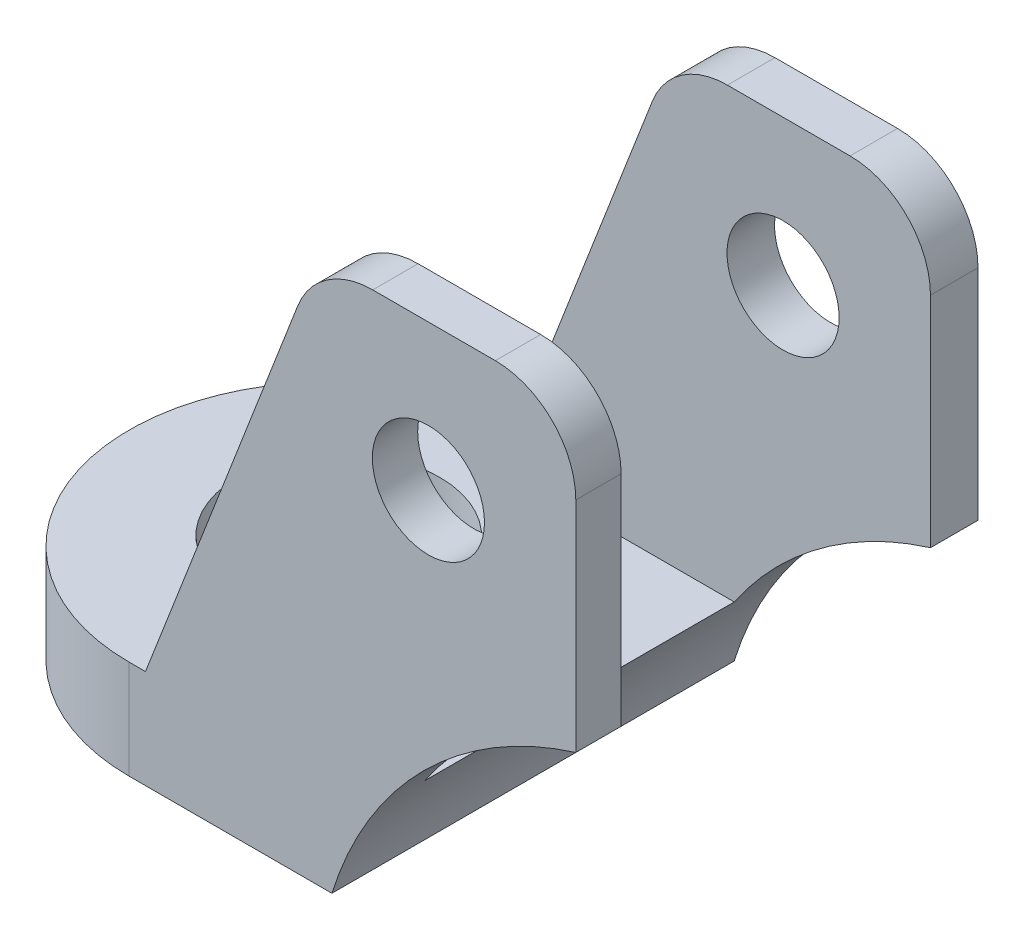
ISO-10303-21;
HEADER;
FILE_DESCRIPTION(('STEP AP214'),'2;1');
FILE_NAME('part.step','',(''),(''),'','','');
FILE_SCHEMA(('AUTOMOTIVE_DESIGN { 1 0 10303 214 1 1 1 1 }'));
ENDSEC;
DATA;
#1=APPLICATION_CONTEXT('core data for automotive mechanical design processes');
#2=APPLICATION_PROTOCOL_DEFINITION('international standard','automotive_design',2000,#1);
#3=PRODUCT_CONTEXT('',#1,'mechanical');
#4=PRODUCT('Part','Part','',(#3));
#5=PRODUCT_RELATED_PRODUCT_CATEGORY('part','',(#4));
#6=PRODUCT_DEFINITION_FORMATION('','',#4);
#7=PRODUCT_DEFINITION_CONTEXT('part definition',#1,'design');
#8=PRODUCT_DEFINITION('design','',#6,#7);
#9=PRODUCT_DEFINITION_SHAPE('','',#8);
#10=(LENGTH_UNIT() NAMED_UNIT(*) SI_UNIT(.MILLI.,.METRE.));
#11=(NAMED_UNIT(*) PLANE_ANGLE_UNIT() SI_UNIT($,.RADIAN.));
#12=(NAMED_UNIT(*) SI_UNIT($,.STERADIAN.) SOLID_ANGLE_UNIT());
#13=UNCERTAINTY_MEASURE_WITH_UNIT(LENGTH_MEASURE(1.E-05),#10,'distance_accuracy_value','');
#14=(GEOMETRIC_REPRESENTATION_CONTEXT(3) GLOBAL_UNCERTAINTY_ASSIGNED_CONTEXT((#13)) GLOBAL_UNIT_ASSIGNED_CONTEXT((#10,
#11,#12)) REPRESENTATION_CONTEXT('',''));
#15=CARTESIAN_POINT('',(0.,0.,0.));
#16=DIRECTION('',(0.,0.,1.));
#17=DIRECTION('',(1.,0.,0.));
#18=AXIS2_PLACEMENT_3D('',#15,#16,#17);
#19=CARTESIAN_POINT('',(70.5138306517146,57.5021615472128,25.));
#20=DIRECTION('',(0.,0.,-1.));
#21=DIRECTION('',(-1.,0.,0.));
#22=AXIS2_PLACEMENT_3D('',#19,#20,#21);
#23=CYLINDRICAL_SURFACE('',#22,10.);
#24=DIRECTION('',(0.,0.,-1.));
#25=VECTOR('',#24,1.);
#26=CARTESIAN_POINT('',(70.5138306517146,67.5021615472128,25.));
#27=LINE('',#26,#25);
#28=CARTESIAN_POINT('',(70.5138306517146,67.5021615472128,25.));
#29=VERTEX_POINT('',#28);
#30=CARTESIAN_POINT('',(70.5138306517146,67.5021615472128,19.3656357552044));
#31=VERTEX_POINT('',#30);
#32=EDGE_CURVE('E319',#29,#31,#27,.T.);
#33=ORIENTED_EDGE('',*,*,#32,.F.);
#34=CARTESIAN_POINT('',(70.5138306517146,57.5021615472128,25.));
#35=DIRECTION('',(0.,0.,-1.));
#36=DIRECTION('',(-1.,0.,0.));
#37=AXIS2_PLACEMENT_3D('',#34,#35,#36);
#38=CIRCLE('',#37,10.);
#39=CARTESIAN_POINT('',(80.5138306517146,57.5021615472128,25.));
#40=VERTEX_POINT('',#39);
#41=EDGE_CURVE('E53',#40,#29,#38,.F.);
#42=ORIENTED_EDGE('',*,*,#41,.F.);
#43=DIRECTION('',(0.,0.,-1.));
#44=VECTOR('',#43,1.);
#45=CARTESIAN_POINT('',(80.5138306517146,57.5021615472128,25.));
#46=LINE('',#45,#44);
#47=CARTESIAN_POINT('',(80.5138306517146,57.5021615472127,19.3656357552044));
#48=VERTEX_POINT('',#47);
#49=EDGE_CURVE('E323',#48,#40,#46,.F.);
#50=ORIENTED_EDGE('',*,*,#49,.F.);
#51=CARTESIAN_POINT('',(70.5138306517146,57.5021615472128,19.3656357552044));
#52=DIRECTION('',(0.,0.,-1.));
#53=DIRECTION('',(-1.,0.,0.));
#54=AXIS2_PLACEMENT_3D('',#51,#52,#53);
#55=CIRCLE('',#54,10.);
#56=EDGE_CURVE('E11',#31,#48,#55,.T.);
#57=ORIENTED_EDGE('',*,*,#56,.F.);
#58=EDGE_LOOP('',(#33,#42,#50,#57));
#59=FACE_BOUND('',#58,.T.);
#60=ADVANCED_FACE('F45',(#59),#23,.T.);
#61=CARTESIAN_POINT('',(55.2703972999553,57.5021615472128,25.));
#62=DIRECTION('',(0.,0.,-1.));
#63=DIRECTION('',(-1.,0.,0.));
#64=AXIS2_PLACEMENT_3D('',#61,#62,#63);
#65=CYLINDRICAL_SURFACE('',#64,10.);
#66=DIRECTION('',(0.,0.,-1.));
#67=VECTOR('',#66,1.);
#68=CARTESIAN_POINT('',(45.9461705454259,61.1158570836572,25.));
#69=LINE('',#68,#67);
#70=CARTESIAN_POINT('',(45.9461705454259,61.1158570836572,25.));
#71=VERTEX_POINT('',#70);
#72=CARTESIAN_POINT('',(45.9461705454259,61.1158570836572,19.3656357552044));
#73=VERTEX_POINT('',#72);
#74=EDGE_CURVE('E304',#71,#73,#69,.T.);
#75=ORIENTED_EDGE('',*,*,#74,.F.);
#76=CARTESIAN_POINT('',(55.2703972999553,57.5021615472128,25.));
#77=DIRECTION('',(0.,0.,-1.));
#78=DIRECTION('',(-1.,0.,0.));
#79=AXIS2_PLACEMENT_3D('',#76,#77,#78);
#80=CIRCLE('',#79,10.);
#81=CARTESIAN_POINT('',(55.2703972999553,67.5021615472128,25.));
#82=VERTEX_POINT('',#81);
#83=EDGE_CURVE('E312',#82,#71,#80,.F.);
#84=ORIENTED_EDGE('',*,*,#83,.F.);
#85=DIRECTION('',(0.,0.,-1.));
#86=VECTOR('',#85,1.);
#87=CARTESIAN_POINT('',(55.2703972999553,67.5021615472128,25.));
#88=LINE('',#87,#86);
#89=CARTESIAN_POINT('',(55.2703972999553,67.5021615472128,19.3656357552044));
#90=VERTEX_POINT('',#89);
#91=EDGE_CURVE('E308',#90,#82,#88,.F.);
#92=ORIENTED_EDGE('',*,*,#91,.F.);
#93=CARTESIAN_POINT('',(55.2703972999553,57.5021615472128,19.3656357552044));
#94=DIRECTION('',(0.,0.,-1.));
#95=DIRECTION('',(-1.,0.,0.));
#96=AXIS2_PLACEMENT_3D('',#93,#94,#95);
#97=CIRCLE('',#96,10.);
#98=EDGE_CURVE('E315',#73,#90,#97,.T.);
#99=ORIENTED_EDGE('',*,*,#98,.F.);
#100=EDGE_LOOP('',(#75,#84,#92,#99));
#101=FACE_BOUND('',#100,.T.);
#102=ADVANCED_FACE('F337',(#101),#65,.T.);
#103=CARTESIAN_POINT('',(70.5138306517146,57.5021615472128,25.));
#104=DIRECTION('',(0.,0.,-1.));
#105=DIRECTION('',(-1.,0.,0.));
#106=AXIS2_PLACEMENT_3D('',#103,#104,#105);
#107=CYLINDRICAL_SURFACE('',#106,10.);
#108=DIRECTION('',(0.,0.,-1.));
#109=VECTOR('',#108,1.);
#110=CARTESIAN_POINT('',(70.5138306517146,67.5021615472128,25.));
#111=LINE('',#110,#109);
#112=CARTESIAN_POINT('',(70.5138306517146,67.5021615472128,-19.0902949624764));
#113=VERTEX_POINT('',#112);
#114=CARTESIAN_POINT('',(70.5138306517146,67.5021615472128,-25.));
#115=VERTEX_POINT('',#114);
#116=EDGE_CURVE('E290',#113,#115,#111,.T.);
#117=ORIENTED_EDGE('',*,*,#116,.F.);
#118=CARTESIAN_POINT('',(70.5138306517146,57.5021615472128,-19.0902949624764));
#119=DIRECTION('',(0.,0.,1.));
#120=DIRECTION('',(1.,0.,0.));
#121=AXIS2_PLACEMENT_3D('',#118,#119,#120);
#122=CIRCLE('',#121,10.);
#123=CARTESIAN_POINT('',(80.5138306517146,57.5021615472127,-19.0902949624764));
#124=VERTEX_POINT('',#123);
#125=EDGE_CURVE('E298',#124,#113,#122,.T.);
#126=ORIENTED_EDGE('',*,*,#125,.F.);
#127=DIRECTION('',(0.,0.,-1.));
#128=VECTOR('',#127,1.);
#129=CARTESIAN_POINT('',(80.5138306517146,57.5021615472128,25.));
#130=LINE('',#129,#128);
#131=CARTESIAN_POINT('',(80.5138306517146,57.5021615472128,-25.));
#132=VERTEX_POINT('',#131);
#133=EDGE_CURVE('E294',#132,#124,#130,.F.);
#134=ORIENTED_EDGE('',*,*,#133,.F.);
#135=CARTESIAN_POINT('',(70.5138306517146,57.5021615472128,-25.));
#136=DIRECTION('',(0.,0.,-1.));
#137=DIRECTION('',(-1.,0.,0.));
#138=AXIS2_PLACEMENT_3D('',#135,#136,#137);
#139=CIRCLE('',#138,10.);
#140=EDGE_CURVE('E301',#115,#132,#139,.T.);
#141=ORIENTED_EDGE('',*,*,#140,.F.);
#142=EDGE_LOOP('',(#117,#126,#134,#141));
#143=FACE_BOUND('',#142,.T.);
#144=ADVANCED_FACE('F395',(#143),#107,.T.);
#145=CARTESIAN_POINT('',(55.2703972999553,57.5021615472128,25.));
#146=DIRECTION('',(0.,0.,-1.));
#147=DIRECTION('',(-1.,0.,0.));
#148=AXIS2_PLACEMENT_3D('',#145,#146,#147);
#149=CYLINDRICAL_SURFACE('',#148,10.);
#150=DIRECTION('',(0.,0.,-1.));
#151=VECTOR('',#150,1.);
#152=CARTESIAN_POINT('',(45.9461705454259,61.1158570836572,25.));
#153=LINE('',#152,#151);
#154=CARTESIAN_POINT('',(45.9461705454259,61.1158570836572,-19.0902949624764));
#155=VERTEX_POINT('',#154);
#156=CARTESIAN_POINT('',(45.9461705454259,61.1158570836572,-25.));
#157=VERTEX_POINT('',#156);
#158=EDGE_CURVE('E275',#155,#157,#153,.T.);
#159=ORIENTED_EDGE('',*,*,#158,.F.);
#160=CARTESIAN_POINT('',(55.2703972999553,57.5021615472128,-19.0902949624764));
#161=DIRECTION('',(0.,0.,1.));
#162=DIRECTION('',(1.,0.,0.));
#163=AXIS2_PLACEMENT_3D('',#160,#161,#162);
#164=CIRCLE('',#163,10.);
#165=CARTESIAN_POINT('',(55.2703972999553,67.5021615472128,-19.0902949624764));
#166=VERTEX_POINT('',#165);
#167=EDGE_CURVE('E283',#166,#155,#164,.T.);
#168=ORIENTED_EDGE('',*,*,#167,.F.);
#169=DIRECTION('',(0.,0.,-1.));
#170=VECTOR('',#169,1.);
#171=CARTESIAN_POINT('',(55.2703972999553,67.5021615472128,25.));
#172=LINE('',#171,#170);
#173=CARTESIAN_POINT('',(55.2703972999553,67.5021615472128,-25.));
#174=VERTEX_POINT('',#173);
#175=EDGE_CURVE('E279',#174,#166,#172,.F.);
#176=ORIENTED_EDGE('',*,*,#175,.F.);
#177=CARTESIAN_POINT('',(55.2703972999553,57.5021615472128,-25.));
#178=DIRECTION('',(0.,0.,-1.));
#179=DIRECTION('',(-1.,0.,0.));
#180=AXIS2_PLACEMENT_3D('',#177,#178,#179);
#181=CIRCLE('',#180,10.);
#182=EDGE_CURVE('E286',#157,#174,#181,.T.);
#183=ORIENTED_EDGE('',*,*,#182,.F.);
#184=EDGE_LOOP('',(#159,#168,#176,#183));
#185=FACE_BOUND('',#184,.T.);
#186=ADVANCED_FACE('F401',(#185),#149,.T.);
#187=CARTESIAN_POINT('',(25.,12.2851292052657,0.));
#188=DIRECTION('',(0.,-1.,0.));
#189=DIRECTION('',(0.,0.,-1.));
#190=AXIS2_PLACEMENT_3D('',#187,#188,#189);
#191=CYLINDRICAL_SURFACE('',#190,25.);
#192=DIRECTION('',(0.,-1.,0.));
#193=VECTOR('',#192,1.);
#194=CARTESIAN_POINT('',(25.,-13.618758536746,25.));
#195=LINE('',#194,#193);
#196=CARTESIAN_POINT('',(25.,12.2851292052657,25.));
#197=VERTEX_POINT('',#196);
#198=CARTESIAN_POINT('',(25.,0.,25.));
#199=VERTEX_POINT('',#198);
#200=EDGE_CURVE('E253',#197,#199,#195,.T.);
#201=ORIENTED_EDGE('',*,*,#200,.F.);
#202=CARTESIAN_POINT('',(25.,12.2851292052657,0.));
#203=DIRECTION('',(0.,-1.,0.));
#204=DIRECTION('',(0.,0.,-1.));
#205=AXIS2_PLACEMENT_3D('',#202,#203,#204);
#206=CIRCLE('',#205,25.);
#207=CARTESIAN_POINT('',(25.,12.2851292052657,-25.));
#208=VERTEX_POINT('',#207);
#209=EDGE_CURVE('E269',#208,#197,#206,.F.);
#210=ORIENTED_EDGE('',*,*,#209,.F.);
#211=DIRECTION('',(0.,1.,0.));
#212=VECTOR('',#211,1.);
#213=CARTESIAN_POINT('',(25.,12.2851292052657,-25.));
#214=LINE('',#213,#212);
#215=CARTESIAN_POINT('',(25.,0.,-25.));
#216=VERTEX_POINT('',#215);
#217=EDGE_CURVE('E265',#216,#208,#214,.T.);
#218=ORIENTED_EDGE('',*,*,#217,.F.);
#219=CARTESIAN_POINT('',(25.,0.,0.));
#220=DIRECTION('',(0.,1.,0.));
#221=DIRECTION('',(0.,0.,1.));
#222=AXIS2_PLACEMENT_3D('',#219,#220,#221);
#223=CIRCLE('',#222,25.);
#224=EDGE_CURVE('E272',#199,#216,#223,.F.);
#225=ORIENTED_EDGE('',*,*,#224,.F.);
#226=EDGE_LOOP('',(#201,#210,#218,#225));
#227=FACE_BOUND('',#226,.T.);
#228=ADVANCED_FACE('F346',(#227),#191,.T.);
#229=CARTESIAN_POINT('',(94.1325891884606,-13.618758536746,25.));
#230=DIRECTION('',(0.,0.,-1.));
#231=DIRECTION('',(-1.,0.,0.));
#232=AXIS2_PLACEMENT_3D('',#229,#230,#231);
#233=CYLINDRICAL_SURFACE('',#232,45.9976089930296);
#234=CARTESIAN_POINT('',(94.1325891884606,-13.618758536746,-19.0902949624764));
#235=DIRECTION('',(0.,0.,1.));
#236=DIRECTION('',(1.,0.,0.));
#237=AXIS2_PLACEMENT_3D('',#234,#235,#236);
#238=CIRCLE('',#237,45.9976089930296);
#239=CARTESIAN_POINT('',(56.1224769428371,12.2851292052657,-19.0902949624764));
#240=VERTEX_POINT('',#239);
#241=CARTESIAN_POINT('',(80.5138306517146,30.3165285226718,-19.0902949624764));
#242=VERTEX_POINT('',#241);
#243=EDGE_CURVE('E186',#240,#242,#238,.F.);
#244=ORIENTED_EDGE('',*,*,#243,.F.);
#245=DIRECTION('',(0.,0.,-1.));
#246=VECTOR('',#245,1.);
#247=CARTESIAN_POINT('',(56.1224769428371,12.2851292052657,25.));
#248=LINE('',#247,#246);
#249=CARTESIAN_POINT('',(56.1224769428371,12.2851292052657,19.3656357552044));
#250=VERTEX_POINT('',#249);
#251=EDGE_CURVE('E174',#250,#240,#248,.T.);
#252=ORIENTED_EDGE('',*,*,#251,.F.);
#253=CARTESIAN_POINT('',(94.1325891884606,-13.618758536746,19.3656357552044));
#254=DIRECTION('',(0.,0.,-1.));
#255=DIRECTION('',(-1.,0.,0.));
#256=AXIS2_PLACEMENT_3D('',#253,#254,#255);
#257=CIRCLE('',#256,45.9976089930296);
#258=CARTESIAN_POINT('',(80.5138306517146,30.3165285226718,19.3656357552044));
#259=VERTEX_POINT('',#258);
#260=EDGE_CURVE('E153',#259,#250,#257,.F.);
#261=ORIENTED_EDGE('',*,*,#260,.F.);
#262=DIRECTION('',(0.,0.,-1.));
#263=VECTOR('',#262,1.);
#264=CARTESIAN_POINT('',(80.5138306517146,30.3165285226719,25.));
#265=LINE('',#264,#263);
#266=CARTESIAN_POINT('',(80.5138306517146,30.3165285226719,25.));
#267=VERTEX_POINT('',#266);
#268=EDGE_CURVE('E246',#267,#259,#265,.T.);
#269=ORIENTED_EDGE('',*,*,#268,.F.);
#270=CARTESIAN_POINT('',(94.1325891884606,-13.618758536746,25.));
#271=DIRECTION('',(0.,0.,-1.));
#272=DIRECTION('',(-1.,0.,0.));
#273=AXIS2_PLACEMENT_3D('',#270,#271,#272);
#274=CIRCLE('',#273,45.9976089930296);
#275=CARTESIAN_POINT('',(50.1973021290427,0.,25.));
#276=VERTEX_POINT('',#275);
#277=EDGE_CURVE('E206',#276,#267,#274,.T.);
#278=ORIENTED_EDGE('',*,*,#277,.F.);
#279=DIRECTION('',(0.,0.,-1.));
#280=VECTOR('',#279,1.);
#281=CARTESIAN_POINT('',(50.1973021290427,0.,25.));
#282=LINE('',#281,#280);
#283=CARTESIAN_POINT('',(50.1973021290427,0.,-25.));
#284=VERTEX_POINT('',#283);
#285=EDGE_CURVE('E249',#276,#284,#282,.T.);
#286=ORIENTED_EDGE('',*,*,#285,.T.);
#287=CARTESIAN_POINT('',(94.1325891884606,-13.618758536746,-25.));
#288=DIRECTION('',(0.,0.,-1.));
#289=DIRECTION('',(-1.,0.,0.));
#290=AXIS2_PLACEMENT_3D('',#287,#288,#289);
#291=CIRCLE('',#290,45.9976089930296);
#292=CARTESIAN_POINT('',(80.5138306517146,30.3165285226719,-25.));
#293=VERTEX_POINT('',#292);
#294=EDGE_CURVE('E227',#284,#293,#291,.T.);
#295=ORIENTED_EDGE('',*,*,#294,.T.);
#296=EDGE_CURVE('E245',#242,#293,#265,.T.);
#297=ORIENTED_EDGE('',*,*,#296,.F.);
#298=EDGE_LOOP('',(#244,#252,#261,#269,#278,#286,#295,#297));
#299=FACE_BOUND('',#298,.T.);
#300=ADVANCED_FACE('F184',(#299),#233,.F.);
#301=CARTESIAN_POINT('',(80.5138306517146,30.3165285226719,25.));
#302=DIRECTION('',(-1.,0.,0.));
#303=DIRECTION('',(0.,0.,1.));
#304=AXIS2_PLACEMENT_3D('',#301,#302,#303);
#305=PLANE('',#304);
#306=DIRECTION('',(0.,1.,0.));
#307=VECTOR('',#306,1.);
#308=CARTESIAN_POINT('',(80.5138306517146,30.3165285226719,-25.));
#309=LINE('',#308,#307);
#310=EDGE_CURVE('E231',#293,#132,#309,.T.);
#311=ORIENTED_EDGE('',*,*,#310,.T.);
#312=ORIENTED_EDGE('',*,*,#133,.T.);
#313=DIRECTION('',(0.,1.,0.));
#314=VECTOR('',#313,1.);
#315=CARTESIAN_POINT('',(80.5138306517146,12.2851292052657,-19.0902949624764));
#316=LINE('',#315,#314);
#317=EDGE_CURVE('E357',#242,#124,#316,.T.);
#318=ORIENTED_EDGE('',*,*,#317,.F.);
#319=ORIENTED_EDGE('',*,*,#296,.T.);
#320=EDGE_LOOP('',(#311,#312,#318,#319));
#321=FACE_BOUND('',#320,.T.);
#322=ADVANCED_FACE('F386',(#321),#305,.F.);
#323=DIRECTION('',(0.,-1.,0.));
#324=VECTOR('',#323,1.);
#325=CARTESIAN_POINT('',(80.5138306517146,12.2851292052657,19.3656357552044));
#326=LINE('',#325,#324);
#327=EDGE_CURVE('E160',#48,#259,#326,.T.);
#328=ORIENTED_EDGE('',*,*,#327,.F.);
#329=ORIENTED_EDGE('',*,*,#49,.T.);
#330=DIRECTION('',(0.,1.,0.));
#331=VECTOR('',#330,1.);
#332=CARTESIAN_POINT('',(80.5138306517146,30.3165285226719,25.));
#333=LINE('',#332,#331);
#334=EDGE_CURVE('E210',#267,#40,#333,.T.);
#335=ORIENTED_EDGE('',*,*,#334,.F.);
#336=ORIENTED_EDGE('',*,*,#268,.T.);
#337=EDGE_LOOP('',(#328,#329,#335,#336));
#338=FACE_BOUND('',#337,.T.);
#339=ADVANCED_FACE('F355',(#338),#305,.F.);
#340=CARTESIAN_POINT('',(80.5138306517146,67.5021615472128,25.));
#341=DIRECTION('',(0.,-1.,0.));
#342=DIRECTION('',(0.,0.,-1.));
#343=AXIS2_PLACEMENT_3D('',#340,#341,#342);
#344=PLANE('',#343);
#345=DIRECTION('',(-1.,0.,0.));
#346=VECTOR('',#345,1.);
#347=CARTESIAN_POINT('',(80.5138306517146,67.5021615472128,-19.0902949624764));
#348=LINE('',#347,#346);
#349=EDGE_CURVE('E258',#113,#166,#348,.T.);
#350=ORIENTED_EDGE('',*,*,#349,.F.);
#351=ORIENTED_EDGE('',*,*,#116,.T.);
#352=DIRECTION('',(-1.,0.,0.));
#353=VECTOR('',#352,1.);
#354=CARTESIAN_POINT('',(80.5138306517146,67.5021615472128,-25.));
#355=LINE('',#354,#353);
#356=EDGE_CURVE('E235',#115,#174,#355,.T.);
#357=ORIENTED_EDGE('',*,*,#356,.T.);
#358=ORIENTED_EDGE('',*,*,#175,.T.);
#359=EDGE_LOOP('',(#350,#351,#357,#358));
#360=FACE_BOUND('',#359,.T.);
#361=ADVANCED_FACE('F398',(#360),#344,.F.);
#362=DIRECTION('',(-1.,0.,0.));
#363=VECTOR('',#362,1.);
#364=CARTESIAN_POINT('',(80.5138306517146,67.5021615472128,25.));
#365=LINE('',#364,#363);
#366=EDGE_CURVE('E214',#29,#82,#365,.T.);
#367=ORIENTED_EDGE('',*,*,#366,.F.);
#368=ORIENTED_EDGE('',*,*,#32,.T.);
#369=DIRECTION('',(-1.,0.,0.));
#370=VECTOR('',#369,1.);
#371=CARTESIAN_POINT('',(80.5138306517146,67.5021615472128,19.3656357552044));
#372=LINE('',#371,#370);
#373=EDGE_CURVE('E180',#31,#90,#372,.T.);
#374=ORIENTED_EDGE('',*,*,#373,.T.);
#375=ORIENTED_EDGE('',*,*,#91,.T.);
#376=EDGE_LOOP('',(#367,#368,#374,#375));
#377=FACE_BOUND('',#376,.T.);
#378=ADVANCED_FACE('F333',(#377),#344,.F.);
#379=CARTESIAN_POINT('',(48.4212454810622,67.5021615472128,25.));
#380=DIRECTION('',(0.93242267545294,-0.361369553644441,0.));
#381=DIRECTION('',(0.361369553644441,0.93242267545294,0.));
#382=AXIS2_PLACEMENT_3D('',#379,#380,#381);
#383=PLANE('',#382);
#384=DIRECTION('',(-0.361369553644441,-0.93242267545294,0.));
#385=VECTOR('',#384,1.);
#386=CARTESIAN_POINT('',(48.4212454810622,67.5021615472128,-19.0902949624764));
#387=LINE('',#386,#385);
#388=CARTESIAN_POINT('',(27.0213429944703,12.2851292052657,-19.0902949624764));
#389=VERTEX_POINT('',#388);
#390=EDGE_CURVE('E195',#155,#389,#387,.T.);
#391=ORIENTED_EDGE('',*,*,#390,.F.);
#392=ORIENTED_EDGE('',*,*,#158,.T.);
#393=DIRECTION('',(-0.361369553644441,-0.93242267545294,0.));
#394=VECTOR('',#393,1.);
#395=CARTESIAN_POINT('',(48.4212454810622,67.5021615472128,-25.));
#396=LINE('',#395,#394);
#397=CARTESIAN_POINT('',(27.0213429944703,12.2851292052657,-25.));
#398=VERTEX_POINT('',#397);
#399=EDGE_CURVE('E238',#157,#398,#396,.T.);
#400=ORIENTED_EDGE('',*,*,#399,.T.);
#401=DIRECTION('',(0.,0.,-1.));
#402=VECTOR('',#401,1.);
#403=CARTESIAN_POINT('',(27.0213429944703,12.2851292052657,25.));
#404=LINE('',#403,#402);
#405=EDGE_CURVE('E224',#389,#398,#404,.T.);
#406=ORIENTED_EDGE('',*,*,#405,.F.);
#407=EDGE_LOOP('',(#391,#392,#400,#406));
#408=FACE_BOUND('',#407,.T.);
#409=ADVANCED_FACE('F380',(#408),#383,.F.);
#410=DIRECTION('',(-0.361369553644441,-0.93242267545294,0.));
#411=VECTOR('',#410,1.);
#412=CARTESIAN_POINT('',(48.4212454810622,67.5021615472128,25.));
#413=LINE('',#412,#411);
#414=CARTESIAN_POINT('',(27.0213429944703,12.2851292052657,25.));
#415=VERTEX_POINT('',#414);
#416=EDGE_CURVE('E217',#71,#415,#413,.T.);
#417=ORIENTED_EDGE('',*,*,#416,.F.);
#418=ORIENTED_EDGE('',*,*,#74,.T.);
#419=DIRECTION('',(0.361369553644441,0.93242267545294,0.));
#420=VECTOR('',#419,1.);
#421=CARTESIAN_POINT('',(48.4212454810622,67.5021615472128,19.3656357552044));
#422=LINE('',#421,#420);
#423=CARTESIAN_POINT('',(27.0213429944703,12.2851292052657,19.3656357552044));
#424=VERTEX_POINT('',#423);
#425=EDGE_CURVE('E167',#424,#73,#422,.T.);
#426=ORIENTED_EDGE('',*,*,#425,.F.);
#427=EDGE_CURVE('E178',#415,#424,#404,.T.);
#428=ORIENTED_EDGE('',*,*,#427,.F.);
#429=EDGE_LOOP('',(#417,#418,#426,#428));
#430=FACE_BOUND('',#429,.T.);
#431=ADVANCED_FACE('F340',(#430),#383,.F.);
#432=CARTESIAN_POINT('',(62.192399065879,49.3996171467291,25.));
#433=DIRECTION('',(0.,0.,-1.));
#434=DIRECTION('',(-1.,0.,0.));
#435=AXIS2_PLACEMENT_3D('',#432,#433,#434);
#436=CYLINDRICAL_SURFACE('',#435,6.96865511048803);
#437=CARTESIAN_POINT('',(62.192399065879,49.3996171467291,-25.));
#438=DIRECTION('',(0.,0.,1.));
#439=DIRECTION('',(1.,0.,0.));
#440=AXIS2_PLACEMENT_3D('',#437,#438,#439);
#441=CIRCLE('',#440,6.96865511048803);
#442=CARTESIAN_POINT('',(69.161054176367,49.3996171467291,-25.));
#443=VERTEX_POINT('',#442);
#444=EDGE_CURVE('E188',#443,#443,#441,.T.);
#445=ORIENTED_EDGE('',*,*,#444,.F.);
#446=EDGE_LOOP('',(#445));
#447=FACE_BOUND('',#446,.T.);
#448=CARTESIAN_POINT('',(62.192399065879,49.3996171467291,-19.0902949624764));
#449=DIRECTION('',(0.,0.,1.));
#450=DIRECTION('',(1.,0.,0.));
#451=AXIS2_PLACEMENT_3D('',#448,#449,#450);
#452=CIRCLE('',#451,6.96865511048803);
#453=CARTESIAN_POINT('',(69.161054176367,49.3996171467291,-19.0902949624764));
#454=VERTEX_POINT('',#453);
#455=EDGE_CURVE('E166',#454,#454,#452,.T.);
#456=ORIENTED_EDGE('',*,*,#455,.T.);
#457=EDGE_LOOP('',(#456));
#458=FACE_BOUND('',#457,.T.);
#459=ADVANCED_FACE('F546',(#447,#458),#436,.F.);
#460=CARTESIAN_POINT('',(62.192399065879,49.3996171467291,25.));
#461=DIRECTION('',(0.,0.,1.));
#462=DIRECTION('',(1.,0.,0.));
#463=AXIS2_PLACEMENT_3D('',#460,#461,#462);
#464=CIRCLE('',#463,6.96865511048803);
#465=CARTESIAN_POINT('',(69.161054176367,49.3996171467291,25.));
#466=VERTEX_POINT('',#465);
#467=EDGE_CURVE('E193',#466,#466,#464,.T.);
#468=ORIENTED_EDGE('',*,*,#467,.T.);
#469=EDGE_LOOP('',(#468));
#470=FACE_BOUND('',#469,.T.);
#471=CARTESIAN_POINT('',(62.192399065879,49.3996171467291,19.3656357552044));
#472=DIRECTION('',(0.,0.,-1.));
#473=DIRECTION('',(-1.,0.,0.));
#474=AXIS2_PLACEMENT_3D('',#471,#472,#473);
#475=CIRCLE('',#474,6.96865511048803);
#476=CARTESIAN_POINT('',(55.223743955391,49.3996171467291,19.3656357552044));
#477=VERTEX_POINT('',#476);
#478=EDGE_CURVE('E254',#477,#477,#475,.T.);
#479=ORIENTED_EDGE('',*,*,#478,.T.);
#480=EDGE_LOOP('',(#479));
#481=FACE_BOUND('',#480,.T.);
#482=ADVANCED_FACE('F537',(#470,#481),#436,.F.);
#483=CARTESIAN_POINT('',(94.1325891884606,-13.618758536746,25.));
#484=DIRECTION('',(0.,0.,-1.));
#485=DIRECTION('',(-1.,0.,0.));
#486=AXIS2_PLACEMENT_3D('',#483,#484,#485);
#487=PLANE('',#486);
#488=ORIENTED_EDGE('',*,*,#334,.T.);
#489=ORIENTED_EDGE('',*,*,#41,.T.);
#490=ORIENTED_EDGE('',*,*,#366,.T.);
#491=ORIENTED_EDGE('',*,*,#83,.T.);
#492=ORIENTED_EDGE('',*,*,#416,.T.);
#493=DIRECTION('',(-1.,0.,0.));
#494=VECTOR('',#493,1.);
#495=CARTESIAN_POINT('',(27.0213429944703,12.2851292052657,25.));
#496=LINE('',#495,#494);
#497=EDGE_CURVE('E220',#415,#197,#496,.T.);
#498=ORIENTED_EDGE('',*,*,#497,.T.);
#499=ORIENTED_EDGE('',*,*,#200,.T.);
#500=DIRECTION('',(1.,0.,0.));
#501=VECTOR('',#500,1.);
#502=CARTESIAN_POINT('',(0.,0.,25.));
#503=LINE('',#502,#501);
#504=EDGE_CURVE('E203',#199,#276,#503,.T.);
#505=ORIENTED_EDGE('',*,*,#504,.T.);
#506=ORIENTED_EDGE('',*,*,#277,.T.);
#507=EDGE_LOOP('',(#488,#489,#490,#491,#492,#498,#499,#505,#506));
#508=FACE_BOUND('',#507,.T.);
#509=ORIENTED_EDGE('',*,*,#467,.F.);
#510=EDGE_LOOP('',(#509));
#511=FACE_BOUND('',#510,.T.);
#512=ADVANCED_FACE('F327',(#508,#511),#487,.F.);
#513=CARTESIAN_POINT('',(94.1325891884606,-13.618758536746,-25.));
#514=DIRECTION('',(0.,0.,-1.));
#515=DIRECTION('',(-1.,0.,0.));
#516=AXIS2_PLACEMENT_3D('',#513,#514,#515);
#517=PLANE('',#516);
#518=ORIENTED_EDGE('',*,*,#356,.F.);
#519=ORIENTED_EDGE('',*,*,#140,.T.);
#520=ORIENTED_EDGE('',*,*,#310,.F.);
#521=ORIENTED_EDGE('',*,*,#294,.F.);
#522=DIRECTION('',(1.,0.,0.));
#523=VECTOR('',#522,1.);
#524=CARTESIAN_POINT('',(0.,0.,-25.));
#525=LINE('',#524,#523);
#526=EDGE_CURVE('E201',#216,#284,#525,.T.);
#527=ORIENTED_EDGE('',*,*,#526,.F.);
#528=ORIENTED_EDGE('',*,*,#217,.T.);
#529=DIRECTION('',(-1.,0.,0.));
#530=VECTOR('',#529,1.);
#531=CARTESIAN_POINT('',(27.0213429944703,12.2851292052657,-25.));
#532=LINE('',#531,#530);
#533=EDGE_CURVE('E207',#398,#208,#532,.T.);
#534=ORIENTED_EDGE('',*,*,#533,.F.);
#535=ORIENTED_EDGE('',*,*,#399,.F.);
#536=ORIENTED_EDGE('',*,*,#182,.T.);
#537=EDGE_LOOP('',(#518,#519,#520,#521,#527,#528,#534,#535,#536));
#538=FACE_BOUND('',#537,.T.);
#539=ORIENTED_EDGE('',*,*,#444,.T.);
#540=EDGE_LOOP('',(#539));
#541=FACE_BOUND('',#540,.T.);
#542=ADVANCED_FACE('F390',(#538,#541),#517,.T.);
#543=CARTESIAN_POINT('',(0.,0.,25.));
#544=DIRECTION('',(0.,1.,0.));
#545=DIRECTION('',(0.,0.,1.));
#546=AXIS2_PLACEMENT_3D('',#543,#544,#545);
#547=PLANE('',#546);
#548=CARTESIAN_POINT('',(24.396705522463,0.,-1.64383020455716));
#549=DIRECTION('',(0.,1.,0.));
#550=DIRECTION('',(0.,0.,1.));
#551=AXIS2_PLACEMENT_3D('',#548,#549,#550);
#552=CIRCLE('',#551,12.1907014797113);
#553=CARTESIAN_POINT('',(24.396705522463,0.,10.5468712751542));
#554=VERTEX_POINT('',#553);
#555=EDGE_CURVE('E363',#554,#554,#552,.T.);
#556=ORIENTED_EDGE('',*,*,#555,.T.);
#557=EDGE_LOOP('',(#556));
#558=FACE_BOUND('',#557,.T.);
#559=ORIENTED_EDGE('',*,*,#504,.F.);
#560=ORIENTED_EDGE('',*,*,#224,.T.);
#561=ORIENTED_EDGE('',*,*,#526,.T.);
#562=ORIENTED_EDGE('',*,*,#285,.F.);
#563=EDGE_LOOP('',(#559,#560,#561,#562));
#564=FACE_BOUND('',#563,.T.);
#565=ADVANCED_FACE('F350',(#558,#564),#547,.F.);
#566=CARTESIAN_POINT('',(27.0213429944703,12.2851292052657,25.));
#567=DIRECTION('',(0.,-1.,0.));
#568=DIRECTION('',(0.,0.,-1.));
#569=AXIS2_PLACEMENT_3D('',#566,#567,#568);
#570=PLANE('',#569);
#571=CARTESIAN_POINT('',(24.396705522463,12.2851292052657,-1.64383020455716));
#572=DIRECTION('',(0.,1.,0.));
#573=DIRECTION('',(0.,0.,1.));
#574=AXIS2_PLACEMENT_3D('',#571,#572,#573);
#575=CIRCLE('',#574,12.5585347);
#576=CARTESIAN_POINT('',(24.396705522463,12.2851292052657,10.9147044954428));
#577=VERTEX_POINT('',#576);
#578=EDGE_CURVE('E569',#577,#577,#575,.T.);
#579=ORIENTED_EDGE('',*,*,#578,.F.);
#580=EDGE_LOOP('',(#579));
#581=FACE_BOUND('',#580,.T.);
#582=ORIENTED_EDGE('',*,*,#533,.T.);
#583=ORIENTED_EDGE('',*,*,#209,.T.);
#584=ORIENTED_EDGE('',*,*,#497,.F.);
#585=ORIENTED_EDGE('',*,*,#427,.T.);
#586=DIRECTION('',(-1.,0.,0.));
#587=VECTOR('',#586,1.);
#588=CARTESIAN_POINT('',(80.5138306517146,12.2851292052657,19.3656357552044));
#589=LINE('',#588,#587);
#590=EDGE_CURVE('E157',#250,#424,#589,.T.);
#591=ORIENTED_EDGE('',*,*,#590,.F.);
#592=ORIENTED_EDGE('',*,*,#251,.T.);
#593=DIRECTION('',(-1.,0.,0.));
#594=VECTOR('',#593,1.);
#595=CARTESIAN_POINT('',(80.5138306517146,12.2851292052657,-19.0902949624764));
#596=LINE('',#595,#594);
#597=EDGE_CURVE('E181',#240,#389,#596,.T.);
#598=ORIENTED_EDGE('',*,*,#597,.T.);
#599=ORIENTED_EDGE('',*,*,#405,.T.);
#600=EDGE_LOOP('',(#582,#583,#584,#585,#591,#592,#598,#599));
#601=FACE_BOUND('',#600,.T.);
#602=ADVANCED_FACE('F172',(#581,#601),#570,.F.);
#603=CARTESIAN_POINT('',(80.5138306517146,12.2851292052657,-19.0902949624764));
#604=DIRECTION('',(0.,0.,1.));
#605=DIRECTION('',(1.,0.,0.));
#606=AXIS2_PLACEMENT_3D('',#603,#604,#605);
#607=PLANE('',#606);
#608=ORIENTED_EDGE('',*,*,#455,.F.);
#609=EDGE_LOOP('',(#608));
#610=FACE_BOUND('',#609,.T.);
#611=ORIENTED_EDGE('',*,*,#317,.T.);
#612=ORIENTED_EDGE('',*,*,#125,.T.);
#613=ORIENTED_EDGE('',*,*,#349,.T.);
#614=ORIENTED_EDGE('',*,*,#167,.T.);
#615=ORIENTED_EDGE('',*,*,#390,.T.);
#616=ORIENTED_EDGE('',*,*,#597,.F.);
#617=ORIENTED_EDGE('',*,*,#243,.T.);
#618=EDGE_LOOP('',(#611,#612,#613,#614,#615,#616,#617));
#619=FACE_BOUND('',#618,.T.);
#620=ADVANCED_FACE('F375',(#610,#619),#607,.T.);
#621=CARTESIAN_POINT('',(80.5138306517146,12.2851292052657,19.3656357552044));
#622=DIRECTION('',(0.,0.,-1.));
#623=DIRECTION('',(-1.,0.,0.));
#624=AXIS2_PLACEMENT_3D('',#621,#622,#623);
#625=PLANE('',#624);
#626=ORIENTED_EDGE('',*,*,#478,.F.);
#627=EDGE_LOOP('',(#626));
#628=FACE_BOUND('',#627,.T.);
#629=ORIENTED_EDGE('',*,*,#373,.F.);
#630=ORIENTED_EDGE('',*,*,#56,.T.);
#631=ORIENTED_EDGE('',*,*,#327,.T.);
#632=ORIENTED_EDGE('',*,*,#260,.T.);
#633=ORIENTED_EDGE('',*,*,#590,.T.);
#634=ORIENTED_EDGE('',*,*,#425,.T.);
#635=ORIENTED_EDGE('',*,*,#98,.T.);
#636=EDGE_LOOP('',(#629,#630,#631,#632,#633,#634,#635));
#637=FACE_BOUND('',#636,.T.);
#638=ADVANCED_FACE('F155',(#628,#637),#625,.T.);
#639=CARTESIAN_POINT('',(24.396705522463,12.2851292052657,-1.64383020455716));
#640=DIRECTION('',(0.,1.,0.));
#641=DIRECTION('',(0.,0.,1.));
#642=AXIS2_PLACEMENT_3D('',#639,#640,#641);
#643=CONICAL_SURFACE('',#642,12.5585347,0.029932396671703);
#644=ORIENTED_EDGE('',*,*,#578,.T.);
#645=EDGE_LOOP('',(#644));
#646=FACE_BOUND('',#645,.T.);
#647=ORIENTED_EDGE('',*,*,#555,.F.);
#648=EDGE_LOOP('',(#647));
#649=FACE_BOUND('',#648,.T.);
#650=ADVANCED_FACE('F482',(#646,#649),#643,.F.);
#651=CLOSED_SHELL('',(#60,#102,#144,#186,#228,#300,#322,#339,#361,#378,#409,#431,#459,#482,#512,
#542,#565,#602,#620,#638,#650));
#652=MANIFOLD_SOLID_BREP('B2',#651);
#653=ADVANCED_BREP_SHAPE_REPRESENTATION('',(#18,#652),#14);
#654=SHAPE_DEFINITION_REPRESENTATION(#9,#653);
ENDSEC;
END-ISO-10303-21;
